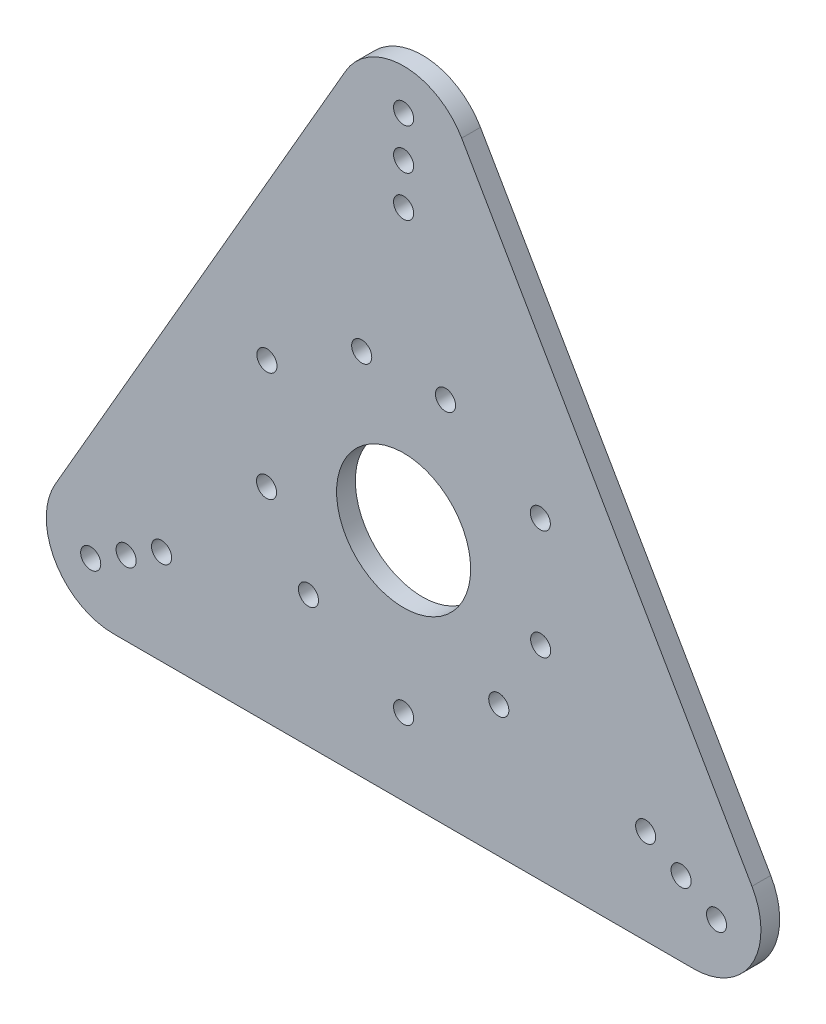
ISO-10303-21;
HEADER;
FILE_DESCRIPTION(('STEP AP214'),'2;1');
FILE_NAME('part.step','',(''),(''),'','','');
FILE_SCHEMA(('AUTOMOTIVE_DESIGN { 1 0 10303 214 1 1 1 1 }'));
ENDSEC;
DATA;
#1=APPLICATION_CONTEXT('core data for automotive mechanical design processes');
#2=APPLICATION_PROTOCOL_DEFINITION('international standard','automotive_design',2000,#1);
#3=PRODUCT_CONTEXT('',#1,'mechanical');
#4=PRODUCT('Part','Part','',(#3));
#5=PRODUCT_RELATED_PRODUCT_CATEGORY('part','',(#4));
#6=PRODUCT_DEFINITION_FORMATION('','',#4);
#7=PRODUCT_DEFINITION_CONTEXT('part definition',#1,'design');
#8=PRODUCT_DEFINITION('design','',#6,#7);
#9=PRODUCT_DEFINITION_SHAPE('','',#8);
#10=(LENGTH_UNIT() NAMED_UNIT(*) SI_UNIT(.MILLI.,.METRE.));
#11=(NAMED_UNIT(*) PLANE_ANGLE_UNIT() SI_UNIT($,.RADIAN.));
#12=(NAMED_UNIT(*) SI_UNIT($,.STERADIAN.) SOLID_ANGLE_UNIT());
#13=UNCERTAINTY_MEASURE_WITH_UNIT(LENGTH_MEASURE(1.E-05),#10,'distance_accuracy_value','');
#14=(GEOMETRIC_REPRESENTATION_CONTEXT(3) GLOBAL_UNCERTAINTY_ASSIGNED_CONTEXT((#13)) GLOBAL_UNIT_ASSIGNED_CONTEXT((#10,
#11,#12)) REPRESENTATION_CONTEXT('',''));
#15=CARTESIAN_POINT('',(0.,0.,0.));
#16=DIRECTION('',(0.,0.,1.));
#17=DIRECTION('',(1.,0.,0.));
#18=AXIS2_PLACEMENT_3D('',#15,#16,#17);
#19=CARTESIAN_POINT('',(71.2078011714026,-72.676944047218,2.8));
#20=DIRECTION('',(0.,0.,1.));
#21=DIRECTION('',(1.,0.,0.));
#22=AXIS2_PLACEMENT_3D('',#19,#20,#21);
#23=PLANE('',#22);
#24=CARTESIAN_POINT('',(128.704579436313,-63.0896028208707,2.8));
#25=DIRECTION('',(0.,0.,1.));
#26=DIRECTION('',(1.,0.,0.));
#27=AXIS2_PLACEMENT_3D('',#24,#25,#26);
#28=CIRCLE('',#27,1.5);
#29=CARTESIAN_POINT('',(130.204579436313,-63.0896028208707,2.8));
#30=VERTEX_POINT('',#29);
#31=EDGE_CURVE('E252',#30,#30,#28,.T.);
#32=ORIENTED_EDGE('',*,*,#31,.F.);
#33=EDGE_LOOP('',(#32));
#34=FACE_BOUND('',#33,.T.);
#35=CARTESIAN_POINT('',(94.0635632849358,-52.2642852735652,2.8));
#36=DIRECTION('',(0.,0.,1.));
#37=DIRECTION('',(1.,0.,0.));
#38=AXIS2_PLACEMENT_3D('',#35,#36,#37);
#39=CIRCLE('',#38,1.5);
#40=CARTESIAN_POINT('',(95.5635632849358,-52.2642852735652,2.8));
#41=VERTEX_POINT('',#40);
#42=EDGE_CURVE('E264',#41,#41,#39,.T.);
#43=ORIENTED_EDGE('',*,*,#42,.F.);
#44=EDGE_LOOP('',(#43));
#45=FACE_BOUND('',#44,.T.);
#46=CARTESIAN_POINT('',(120.759071360625,-27.676944047218,2.8));
#47=DIRECTION('',(0.,0.,1.));
#48=DIRECTION('',(1.,0.,0.));
#49=AXIS2_PLACEMENT_3D('',#46,#47,#48);
#50=CIRCLE('',#49,1.5);
#51=CARTESIAN_POINT('',(122.259071360625,-27.676944047218,2.8));
#52=VERTEX_POINT('',#51);
#53=EDGE_CURVE('E276',#52,#52,#50,.T.);
#54=ORIENTED_EDGE('',*,*,#53,.F.);
#55=EDGE_LOOP('',(#54));
#56=FACE_BOUND('',#55,.T.);
#57=CARTESIAN_POINT('',(150.615835507907,-68.523194047218,2.8));
#58=DIRECTION('',(0.,0.,1.));
#59=DIRECTION('',(1.,0.,0.));
#60=AXIS2_PLACEMENT_3D('',#57,#58,#59);
#61=CIRCLE('',#60,1.5);
#62=CARTESIAN_POINT('',(152.115835507907,-68.523194047218,2.8));
#63=VERTEX_POINT('',#62);
#64=EDGE_CURVE('E288',#63,#63,#61,.T.);
#65=ORIENTED_EDGE('',*,*,#64,.F.);
#66=EDGE_LOOP('',(#65));
#67=FACE_BOUND('',#66,.T.);
#68=CARTESIAN_POINT('',(161.185675561096,-74.625694047218,2.8));
#69=DIRECTION('',(0.,0.,1.));
#70=DIRECTION('',(1.,0.,0.));
#71=AXIS2_PLACEMENT_3D('',#68,#69,#70);
#72=CIRCLE('',#71,1.5);
#73=CARTESIAN_POINT('',(162.685675561096,-74.625694047218,2.8));
#74=VERTEX_POINT('',#73);
#75=EDGE_CURVE('E300',#74,#74,#72,.T.);
#76=ORIENTED_EDGE('',*,*,#75,.F.);
#77=EDGE_LOOP('',(#76));
#78=FACE_BOUND('',#77,.T.);
#79=CARTESIAN_POINT('',(73.1173871867473,-71.5744440472179,2.8));
#80=DIRECTION('',(0.,0.,1.));
#81=DIRECTION('',(1.,0.,0.));
#82=AXIS2_PLACEMENT_3D('',#79,#80,#81);
#83=CIRCLE('',#82,1.5);
#84=CARTESIAN_POINT('',(74.6173871867473,-71.5744440472179,2.8));
#85=VERTEX_POINT('',#84);
#86=EDGE_CURVE('E312',#85,#85,#83,.T.);
#87=ORIENTED_EDGE('',*,*,#86,.F.);
#88=EDGE_LOOP('',(#87));
#89=FACE_BOUND('',#88,.T.);
#90=CARTESIAN_POINT('',(114.509071360625,-5.98444404721797,2.8));
#91=DIRECTION('',(0.,0.,1.));
#92=DIRECTION('',(1.,0.,0.));
#93=AXIS2_PLACEMENT_3D('',#90,#91,#92);
#94=CIRCLE('',#93,1.5);
#95=CARTESIAN_POINT('',(116.009071360625,-5.98444404721797,2.8));
#96=VERTEX_POINT('',#95);
#97=EDGE_CURVE('E324',#96,#96,#94,.T.);
#98=ORIENTED_EDGE('',*,*,#97,.F.);
#99=EDGE_LOOP('',(#98));
#100=FACE_BOUND('',#99,.T.);
#101=CARTESIAN_POINT('',(114.509071360624,6.22055595278204,2.8));
#102=DIRECTION('',(0.,0.,1.));
#103=DIRECTION('',(1.,0.,0.));
#104=AXIS2_PLACEMENT_3D('',#101,#102,#103);
#105=CIRCLE('',#104,1.5);
#106=CARTESIAN_POINT('',(116.009071360624,6.22055595278204,2.8));
#107=VERTEX_POINT('',#106);
#108=EDGE_CURVE('E336',#107,#107,#105,.T.);
#109=ORIENTED_EDGE('',*,*,#108,.F.);
#110=EDGE_LOOP('',(#109));
#111=FACE_BOUND('',#110,.T.);
#112=CARTESIAN_POINT('',(134.899639492729,-35.904444047218,2.8));
#113=DIRECTION('',(0.,0.,1.));
#114=DIRECTION('',(1.,0.,0.));
#115=AXIS2_PLACEMENT_3D('',#112,#113,#114);
#116=CIRCLE('',#115,1.5);
#117=CARTESIAN_POINT('',(136.399639492729,-35.904444047218,2.8));
#118=VERTEX_POINT('',#117);
#119=EDGE_CURVE('E348',#118,#118,#116,.T.);
#120=ORIENTED_EDGE('',*,*,#119,.F.);
#121=EDGE_LOOP('',(#120));
#122=FACE_BOUND('',#121,.T.);
#123=CARTESIAN_POINT('',(71.2078011714026,-72.676944047218,2.8));
#124=DIRECTION('',(0.,0.,1.));
#125=DIRECTION('',(1.,0.,0.));
#126=AXIS2_PLACEMENT_3D('',#123,#124,#125);
#127=CIRCLE('',#126,9.99999999999999);
#128=CARTESIAN_POINT('',(62.5475471335583,-67.676944047218,2.8));
#129=VERTEX_POINT('',#128);
#130=CARTESIAN_POINT('',(71.2078011714026,-82.676944047218,2.8));
#131=VERTEX_POINT('',#130);
#132=EDGE_CURVE('E132',#129,#131,#127,.T.);
#133=ORIENTED_EDGE('',*,*,#132,.T.);
#134=DIRECTION('',(1.,0.,0.));
#135=VECTOR('',#134,1.);
#136=CARTESIAN_POINT('',(71.2078011714026,-82.676944047218,2.8));
#137=LINE('',#136,#135);
#138=CARTESIAN_POINT('',(157.810341549847,-82.676944047218,2.8));
#139=VERTEX_POINT('',#138);
#140=EDGE_CURVE('E90',#131,#139,#137,.T.);
#141=ORIENTED_EDGE('',*,*,#140,.T.);
#142=CARTESIAN_POINT('',(157.810341549846,-72.676944047218,2.8));
#143=DIRECTION('',(0.,0.,1.));
#144=DIRECTION('',(1.,0.,0.));
#145=AXIS2_PLACEMENT_3D('',#142,#143,#144);
#146=CIRCLE('',#145,10.);
#147=CARTESIAN_POINT('',(166.470595587691,-67.676944047218,2.8));
#148=VERTEX_POINT('',#147);
#149=EDGE_CURVE('E103',#139,#148,#146,.T.);
#150=ORIENTED_EDGE('',*,*,#149,.T.);
#151=DIRECTION('',(-0.5,0.866025403784438,0.));
#152=VECTOR('',#151,1.);
#153=CARTESIAN_POINT('',(166.470595587691,-67.676944047218,2.8));
#154=LINE('',#153,#152);
#155=CARTESIAN_POINT('',(123.169325398469,7.32305595278203,2.8));
#156=VERTEX_POINT('',#155);
#157=EDGE_CURVE('E97',#148,#156,#154,.T.);
#158=ORIENTED_EDGE('',*,*,#157,.T.);
#159=CARTESIAN_POINT('',(114.509071360625,2.32305595278204,2.8));
#160=DIRECTION('',(0.,0.,1.));
#161=DIRECTION('',(1.,0.,0.));
#162=AXIS2_PLACEMENT_3D('',#159,#160,#161);
#163=CIRCLE('',#162,9.99999999999998);
#164=CARTESIAN_POINT('',(105.84881732278,7.32305595278203,2.8));
#165=VERTEX_POINT('',#164);
#166=EDGE_CURVE('E101',#156,#165,#163,.T.);
#167=ORIENTED_EDGE('',*,*,#166,.T.);
#168=DIRECTION('',(-0.5,-0.866025403784439,0.));
#169=VECTOR('',#168,1.);
#170=CARTESIAN_POINT('',(105.84881732278,7.32305595278203,2.8));
#171=LINE('',#170,#169);
#172=EDGE_CURVE('E53',#165,#129,#171,.T.);
#173=ORIENTED_EDGE('',*,*,#172,.T.);
#174=EDGE_LOOP('',(#133,#141,#150,#158,#167,#173));
#175=FACE_BOUND('',#174,.T.);
#176=CARTESIAN_POINT('',(114.509071360624,-71.221944047218,2.8));
#177=DIRECTION('',(0.,0.,1.));
#178=DIRECTION('',(1.,0.,0.));
#179=AXIS2_PLACEMENT_3D('',#176,#177,#178);
#180=CIRCLE('',#179,1.5);
#181=CARTESIAN_POINT('',(116.009071360624,-71.221944047218,2.8));
#182=VERTEX_POINT('',#181);
#183=EDGE_CURVE('E125',#182,#182,#180,.T.);
#184=ORIENTED_EDGE('',*,*,#183,.F.);
#185=EDGE_LOOP('',(#184));
#186=FACE_BOUND('',#185,.T.);
#187=CARTESIAN_POINT('',(94.1185032285199,-35.904444047218,2.8));
#188=DIRECTION('',(0.,0.,1.));
#189=DIRECTION('',(1.,0.,0.));
#190=AXIS2_PLACEMENT_3D('',#187,#188,#189);
#191=CIRCLE('',#190,1.5);
#192=CARTESIAN_POINT('',(95.6185032285199,-35.904444047218,2.8));
#193=VERTEX_POINT('',#192);
#194=EDGE_CURVE('E342',#193,#193,#191,.T.);
#195=ORIENTED_EDGE('',*,*,#194,.F.);
#196=EDGE_LOOP('',(#195));
#197=FACE_BOUND('',#196,.T.);
#198=CARTESIAN_POINT('',(114.509071360624,0.11805595278204,2.8));
#199=DIRECTION('',(0.,0.,1.));
#200=DIRECTION('',(1.,0.,0.));
#201=AXIS2_PLACEMENT_3D('',#198,#199,#200);
#202=CIRCLE('',#201,1.5);
#203=CARTESIAN_POINT('',(116.009071360624,0.11805595278204,2.8));
#204=VERTEX_POINT('',#203);
#205=EDGE_CURVE('E330',#204,#204,#202,.T.);
#206=ORIENTED_EDGE('',*,*,#205,.F.);
#207=EDGE_LOOP('',(#206));
#208=FACE_BOUND('',#207,.T.);
#209=CARTESIAN_POINT('',(67.8324671601528,-74.625694047218,2.8));
#210=DIRECTION('',(0.,0.,1.));
#211=DIRECTION('',(1.,0.,0.));
#212=AXIS2_PLACEMENT_3D('',#209,#210,#211);
#213=CIRCLE('',#212,1.5);
#214=CARTESIAN_POINT('',(69.3324671601528,-74.625694047218,2.8));
#215=VERTEX_POINT('',#214);
#216=EDGE_CURVE('E318',#215,#215,#213,.T.);
#217=ORIENTED_EDGE('',*,*,#216,.F.);
#218=EDGE_LOOP('',(#217));
#219=FACE_BOUND('',#218,.T.);
#220=CARTESIAN_POINT('',(78.4023072133418,-68.5231940472179,2.8));
#221=DIRECTION('',(0.,0.,1.));
#222=DIRECTION('',(1.,0.,0.));
#223=AXIS2_PLACEMENT_3D('',#220,#221,#222);
#224=CIRCLE('',#223,1.5);
#225=CARTESIAN_POINT('',(79.9023072133419,-68.5231940472179,2.8));
#226=VERTEX_POINT('',#225);
#227=EDGE_CURVE('E306',#226,#226,#224,.T.);
#228=ORIENTED_EDGE('',*,*,#227,.F.);
#229=EDGE_LOOP('',(#228));
#230=FACE_BOUND('',#229,.T.);
#231=CARTESIAN_POINT('',(155.900755534502,-71.574444047218,2.8));
#232=DIRECTION('',(0.,0.,1.));
#233=DIRECTION('',(1.,0.,0.));
#234=AXIS2_PLACEMENT_3D('',#231,#232,#233);
#235=CIRCLE('',#234,1.5);
#236=CARTESIAN_POINT('',(157.400755534502,-71.574444047218,2.8));
#237=VERTEX_POINT('',#236);
#238=EDGE_CURVE('E294',#237,#237,#235,.T.);
#239=ORIENTED_EDGE('',*,*,#238,.F.);
#240=EDGE_LOOP('',(#239));
#241=FACE_BOUND('',#240,.T.);
#242=CARTESIAN_POINT('',(108.259071360625,-27.676944047218,2.8));
#243=DIRECTION('',(0.,0.,1.));
#244=DIRECTION('',(1.,0.,0.));
#245=AXIS2_PLACEMENT_3D('',#242,#243,#244);
#246=CIRCLE('',#245,1.5);
#247=CARTESIAN_POINT('',(109.759071360625,-27.676944047218,2.8));
#248=VERTEX_POINT('',#247);
#249=EDGE_CURVE('E282',#248,#248,#246,.T.);
#250=ORIENTED_EDGE('',*,*,#249,.F.);
#251=EDGE_LOOP('',(#250));
#252=FACE_BOUND('',#251,.T.);
#253=CARTESIAN_POINT('',(100.313563284936,-63.0896028208707,2.8));
#254=DIRECTION('',(0.,0.,1.));
#255=DIRECTION('',(1.,0.,0.));
#256=AXIS2_PLACEMENT_3D('',#253,#254,#255);
#257=CIRCLE('',#256,1.5);
#258=CARTESIAN_POINT('',(101.813563284936,-63.0896028208707,2.8));
#259=VERTEX_POINT('',#258);
#260=EDGE_CURVE('E270',#259,#259,#257,.T.);
#261=ORIENTED_EDGE('',*,*,#260,.F.);
#262=EDGE_LOOP('',(#261));
#263=FACE_BOUND('',#262,.T.);
#264=CARTESIAN_POINT('',(134.954579436313,-52.2642852735652,2.8));
#265=DIRECTION('',(0.,0.,1.));
#266=DIRECTION('',(1.,0.,0.));
#267=AXIS2_PLACEMENT_3D('',#264,#265,#266);
#268=CIRCLE('',#267,1.5);
#269=CARTESIAN_POINT('',(136.454579436313,-52.2642852735652,2.8));
#270=VERTEX_POINT('',#269);
#271=EDGE_CURVE('E258',#270,#270,#268,.T.);
#272=ORIENTED_EDGE('',*,*,#271,.F.);
#273=EDGE_LOOP('',(#272));
#274=FACE_BOUND('',#273,.T.);
#275=CARTESIAN_POINT('',(114.509071360625,-47.676944047218,2.8));
#276=DIRECTION('',(0.,0.,1.));
#277=DIRECTION('',(1.,0.,0.));
#278=AXIS2_PLACEMENT_3D('',#275,#276,#277);
#279=CIRCLE('',#278,10.);
#280=CARTESIAN_POINT('',(124.509071360625,-47.676944047218,2.8));
#281=VERTEX_POINT('',#280);
#282=EDGE_CURVE('E243',#281,#281,#279,.T.);
#283=ORIENTED_EDGE('',*,*,#282,.F.);
#284=EDGE_LOOP('',(#283));
#285=FACE_BOUND('',#284,.T.);
#286=ADVANCED_FACE('F36',(#34,#45,#56,#67,#78,#89,#100,#111,#122,#175,#186,#197,#208,#219,#230,
#241,#252,#263,#274,#285),#23,.T.);
#287=CARTESIAN_POINT('',(71.2078011714026,-72.676944047218,0.));
#288=DIRECTION('',(0.,0.,1.));
#289=DIRECTION('',(1.,0.,0.));
#290=AXIS2_PLACEMENT_3D('',#287,#288,#289);
#291=PLANE('',#290);
#292=CARTESIAN_POINT('',(71.2078011714026,-72.676944047218,0.));
#293=DIRECTION('',(0.,0.,1.));
#294=DIRECTION('',(1.,0.,0.));
#295=AXIS2_PLACEMENT_3D('',#292,#293,#294);
#296=CIRCLE('',#295,9.99999999999999);
#297=CARTESIAN_POINT('',(62.5475471335583,-67.676944047218,0.));
#298=VERTEX_POINT('',#297);
#299=CARTESIAN_POINT('',(71.2078011714026,-82.676944047218,0.));
#300=VERTEX_POINT('',#299);
#301=EDGE_CURVE('E121',#298,#300,#296,.T.);
#302=ORIENTED_EDGE('',*,*,#301,.F.);
#303=DIRECTION('',(-0.5,-0.866025403784439,0.));
#304=VECTOR('',#303,1.);
#305=CARTESIAN_POINT('',(105.84881732278,7.32305595278203,0.));
#306=LINE('',#305,#304);
#307=CARTESIAN_POINT('',(105.84881732278,7.32305595278203,0.));
#308=VERTEX_POINT('',#307);
#309=EDGE_CURVE('E82',#308,#298,#306,.T.);
#310=ORIENTED_EDGE('',*,*,#309,.F.);
#311=CARTESIAN_POINT('',(114.509071360625,2.32305595278204,0.));
#312=DIRECTION('',(0.,0.,1.));
#313=DIRECTION('',(1.,0.,0.));
#314=AXIS2_PLACEMENT_3D('',#311,#312,#313);
#315=CIRCLE('',#314,9.99999999999998);
#316=CARTESIAN_POINT('',(123.169325398469,7.32305595278203,0.));
#317=VERTEX_POINT('',#316);
#318=EDGE_CURVE('E76',#317,#308,#315,.T.);
#319=ORIENTED_EDGE('',*,*,#318,.F.);
#320=DIRECTION('',(-0.5,0.866025403784438,0.));
#321=VECTOR('',#320,1.);
#322=CARTESIAN_POINT('',(166.470595587691,-67.676944047218,0.));
#323=LINE('',#322,#321);
#324=CARTESIAN_POINT('',(166.470595587691,-67.676944047218,0.));
#325=VERTEX_POINT('',#324);
#326=EDGE_CURVE('E111',#325,#317,#323,.T.);
#327=ORIENTED_EDGE('',*,*,#326,.F.);
#328=CARTESIAN_POINT('',(157.810341549846,-72.676944047218,0.));
#329=DIRECTION('',(0.,0.,1.));
#330=DIRECTION('',(1.,0.,0.));
#331=AXIS2_PLACEMENT_3D('',#328,#329,#330);
#332=CIRCLE('',#331,10.);
#333=CARTESIAN_POINT('',(157.810341549847,-82.676944047218,0.));
#334=VERTEX_POINT('',#333);
#335=EDGE_CURVE('E127',#334,#325,#332,.T.);
#336=ORIENTED_EDGE('',*,*,#335,.F.);
#337=DIRECTION('',(1.,0.,0.));
#338=VECTOR('',#337,1.);
#339=CARTESIAN_POINT('',(71.2078011714026,-82.676944047218,0.));
#340=LINE('',#339,#338);
#341=EDGE_CURVE('E124',#300,#334,#340,.T.);
#342=ORIENTED_EDGE('',*,*,#341,.F.);
#343=EDGE_LOOP('',(#302,#310,#319,#327,#336,#342));
#344=FACE_BOUND('',#343,.T.);
#345=CARTESIAN_POINT('',(114.509071360624,-71.221944047218,0.));
#346=DIRECTION('',(0.,0.,1.));
#347=DIRECTION('',(1.,0.,0.));
#348=AXIS2_PLACEMENT_3D('',#345,#346,#347);
#349=CIRCLE('',#348,1.5);
#350=CARTESIAN_POINT('',(116.009071360624,-71.221944047218,0.));
#351=VERTEX_POINT('',#350);
#352=EDGE_CURVE('E351',#351,#351,#349,.T.);
#353=ORIENTED_EDGE('',*,*,#352,.T.);
#354=EDGE_LOOP('',(#353));
#355=FACE_BOUND('',#354,.T.);
#356=CARTESIAN_POINT('',(134.899639492729,-35.904444047218,0.));
#357=DIRECTION('',(0.,0.,1.));
#358=DIRECTION('',(1.,0.,0.));
#359=AXIS2_PLACEMENT_3D('',#356,#357,#358);
#360=CIRCLE('',#359,1.5);
#361=CARTESIAN_POINT('',(136.399639492729,-35.904444047218,0.));
#362=VERTEX_POINT('',#361);
#363=EDGE_CURVE('E345',#362,#362,#360,.T.);
#364=ORIENTED_EDGE('',*,*,#363,.T.);
#365=EDGE_LOOP('',(#364));
#366=FACE_BOUND('',#365,.T.);
#367=CARTESIAN_POINT('',(94.1185032285199,-35.904444047218,0.));
#368=DIRECTION('',(0.,0.,1.));
#369=DIRECTION('',(1.,0.,0.));
#370=AXIS2_PLACEMENT_3D('',#367,#368,#369);
#371=CIRCLE('',#370,1.5);
#372=CARTESIAN_POINT('',(95.6185032285199,-35.904444047218,0.));
#373=VERTEX_POINT('',#372);
#374=EDGE_CURVE('E339',#373,#373,#371,.T.);
#375=ORIENTED_EDGE('',*,*,#374,.T.);
#376=EDGE_LOOP('',(#375));
#377=FACE_BOUND('',#376,.T.);
#378=CARTESIAN_POINT('',(114.509071360624,6.22055595278204,0.));
#379=DIRECTION('',(0.,0.,1.));
#380=DIRECTION('',(1.,0.,0.));
#381=AXIS2_PLACEMENT_3D('',#378,#379,#380);
#382=CIRCLE('',#381,1.5);
#383=CARTESIAN_POINT('',(116.009071360624,6.22055595278204,0.));
#384=VERTEX_POINT('',#383);
#385=EDGE_CURVE('E333',#384,#384,#382,.T.);
#386=ORIENTED_EDGE('',*,*,#385,.T.);
#387=EDGE_LOOP('',(#386));
#388=FACE_BOUND('',#387,.T.);
#389=CARTESIAN_POINT('',(114.509071360624,0.11805595278204,0.));
#390=DIRECTION('',(0.,0.,1.));
#391=DIRECTION('',(1.,0.,0.));
#392=AXIS2_PLACEMENT_3D('',#389,#390,#391);
#393=CIRCLE('',#392,1.5);
#394=CARTESIAN_POINT('',(116.009071360624,0.11805595278204,0.));
#395=VERTEX_POINT('',#394);
#396=EDGE_CURVE('E327',#395,#395,#393,.T.);
#397=ORIENTED_EDGE('',*,*,#396,.T.);
#398=EDGE_LOOP('',(#397));
#399=FACE_BOUND('',#398,.T.);
#400=CARTESIAN_POINT('',(114.509071360625,-5.98444404721797,0.));
#401=DIRECTION('',(0.,0.,1.));
#402=DIRECTION('',(1.,0.,0.));
#403=AXIS2_PLACEMENT_3D('',#400,#401,#402);
#404=CIRCLE('',#403,1.5);
#405=CARTESIAN_POINT('',(116.009071360625,-5.98444404721797,0.));
#406=VERTEX_POINT('',#405);
#407=EDGE_CURVE('E321',#406,#406,#404,.T.);
#408=ORIENTED_EDGE('',*,*,#407,.T.);
#409=EDGE_LOOP('',(#408));
#410=FACE_BOUND('',#409,.T.);
#411=CARTESIAN_POINT('',(67.8324671601528,-74.625694047218,0.));
#412=DIRECTION('',(0.,0.,1.));
#413=DIRECTION('',(1.,0.,0.));
#414=AXIS2_PLACEMENT_3D('',#411,#412,#413);
#415=CIRCLE('',#414,1.5);
#416=CARTESIAN_POINT('',(69.3324671601528,-74.625694047218,0.));
#417=VERTEX_POINT('',#416);
#418=EDGE_CURVE('E315',#417,#417,#415,.T.);
#419=ORIENTED_EDGE('',*,*,#418,.T.);
#420=EDGE_LOOP('',(#419));
#421=FACE_BOUND('',#420,.T.);
#422=CARTESIAN_POINT('',(73.1173871867473,-71.5744440472179,0.));
#423=DIRECTION('',(0.,0.,1.));
#424=DIRECTION('',(1.,0.,0.));
#425=AXIS2_PLACEMENT_3D('',#422,#423,#424);
#426=CIRCLE('',#425,1.5);
#427=CARTESIAN_POINT('',(74.6173871867473,-71.5744440472179,0.));
#428=VERTEX_POINT('',#427);
#429=EDGE_CURVE('E309',#428,#428,#426,.T.);
#430=ORIENTED_EDGE('',*,*,#429,.T.);
#431=EDGE_LOOP('',(#430));
#432=FACE_BOUND('',#431,.T.);
#433=CARTESIAN_POINT('',(78.4023072133418,-68.5231940472179,0.));
#434=DIRECTION('',(0.,0.,1.));
#435=DIRECTION('',(1.,0.,0.));
#436=AXIS2_PLACEMENT_3D('',#433,#434,#435);
#437=CIRCLE('',#436,1.5);
#438=CARTESIAN_POINT('',(79.9023072133419,-68.5231940472179,0.));
#439=VERTEX_POINT('',#438);
#440=EDGE_CURVE('E303',#439,#439,#437,.T.);
#441=ORIENTED_EDGE('',*,*,#440,.T.);
#442=EDGE_LOOP('',(#441));
#443=FACE_BOUND('',#442,.T.);
#444=CARTESIAN_POINT('',(161.185675561096,-74.625694047218,0.));
#445=DIRECTION('',(0.,0.,1.));
#446=DIRECTION('',(1.,0.,0.));
#447=AXIS2_PLACEMENT_3D('',#444,#445,#446);
#448=CIRCLE('',#447,1.5);
#449=CARTESIAN_POINT('',(162.685675561096,-74.625694047218,0.));
#450=VERTEX_POINT('',#449);
#451=EDGE_CURVE('E297',#450,#450,#448,.T.);
#452=ORIENTED_EDGE('',*,*,#451,.T.);
#453=EDGE_LOOP('',(#452));
#454=FACE_BOUND('',#453,.T.);
#455=CARTESIAN_POINT('',(155.900755534502,-71.574444047218,0.));
#456=DIRECTION('',(0.,0.,1.));
#457=DIRECTION('',(1.,0.,0.));
#458=AXIS2_PLACEMENT_3D('',#455,#456,#457);
#459=CIRCLE('',#458,1.5);
#460=CARTESIAN_POINT('',(157.400755534502,-71.574444047218,0.));
#461=VERTEX_POINT('',#460);
#462=EDGE_CURVE('E291',#461,#461,#459,.T.);
#463=ORIENTED_EDGE('',*,*,#462,.T.);
#464=EDGE_LOOP('',(#463));
#465=FACE_BOUND('',#464,.T.);
#466=CARTESIAN_POINT('',(150.615835507907,-68.523194047218,0.));
#467=DIRECTION('',(0.,0.,1.));
#468=DIRECTION('',(1.,0.,0.));
#469=AXIS2_PLACEMENT_3D('',#466,#467,#468);
#470=CIRCLE('',#469,1.5);
#471=CARTESIAN_POINT('',(152.115835507907,-68.523194047218,0.));
#472=VERTEX_POINT('',#471);
#473=EDGE_CURVE('E285',#472,#472,#470,.T.);
#474=ORIENTED_EDGE('',*,*,#473,.T.);
#475=EDGE_LOOP('',(#474));
#476=FACE_BOUND('',#475,.T.);
#477=CARTESIAN_POINT('',(108.259071360625,-27.676944047218,0.));
#478=DIRECTION('',(0.,0.,1.));
#479=DIRECTION('',(1.,0.,0.));
#480=AXIS2_PLACEMENT_3D('',#477,#478,#479);
#481=CIRCLE('',#480,1.5);
#482=CARTESIAN_POINT('',(109.759071360625,-27.676944047218,0.));
#483=VERTEX_POINT('',#482);
#484=EDGE_CURVE('E279',#483,#483,#481,.T.);
#485=ORIENTED_EDGE('',*,*,#484,.T.);
#486=EDGE_LOOP('',(#485));
#487=FACE_BOUND('',#486,.T.);
#488=CARTESIAN_POINT('',(120.759071360625,-27.676944047218,0.));
#489=DIRECTION('',(0.,0.,1.));
#490=DIRECTION('',(1.,0.,0.));
#491=AXIS2_PLACEMENT_3D('',#488,#489,#490);
#492=CIRCLE('',#491,1.5);
#493=CARTESIAN_POINT('',(122.259071360625,-27.676944047218,0.));
#494=VERTEX_POINT('',#493);
#495=EDGE_CURVE('E273',#494,#494,#492,.T.);
#496=ORIENTED_EDGE('',*,*,#495,.T.);
#497=EDGE_LOOP('',(#496));
#498=FACE_BOUND('',#497,.T.);
#499=CARTESIAN_POINT('',(100.313563284936,-63.0896028208707,0.));
#500=DIRECTION('',(0.,0.,1.));
#501=DIRECTION('',(1.,0.,0.));
#502=AXIS2_PLACEMENT_3D('',#499,#500,#501);
#503=CIRCLE('',#502,1.5);
#504=CARTESIAN_POINT('',(101.813563284936,-63.0896028208707,0.));
#505=VERTEX_POINT('',#504);
#506=EDGE_CURVE('E267',#505,#505,#503,.T.);
#507=ORIENTED_EDGE('',*,*,#506,.T.);
#508=EDGE_LOOP('',(#507));
#509=FACE_BOUND('',#508,.T.);
#510=CARTESIAN_POINT('',(94.0635632849358,-52.2642852735652,0.));
#511=DIRECTION('',(0.,0.,1.));
#512=DIRECTION('',(1.,0.,0.));
#513=AXIS2_PLACEMENT_3D('',#510,#511,#512);
#514=CIRCLE('',#513,1.5);
#515=CARTESIAN_POINT('',(95.5635632849358,-52.2642852735652,0.));
#516=VERTEX_POINT('',#515);
#517=EDGE_CURVE('E261',#516,#516,#514,.T.);
#518=ORIENTED_EDGE('',*,*,#517,.T.);
#519=EDGE_LOOP('',(#518));
#520=FACE_BOUND('',#519,.T.);
#521=CARTESIAN_POINT('',(134.954579436313,-52.2642852735652,0.));
#522=DIRECTION('',(0.,0.,1.));
#523=DIRECTION('',(1.,0.,0.));
#524=AXIS2_PLACEMENT_3D('',#521,#522,#523);
#525=CIRCLE('',#524,1.5);
#526=CARTESIAN_POINT('',(136.454579436313,-52.2642852735652,0.));
#527=VERTEX_POINT('',#526);
#528=EDGE_CURVE('E255',#527,#527,#525,.T.);
#529=ORIENTED_EDGE('',*,*,#528,.T.);
#530=EDGE_LOOP('',(#529));
#531=FACE_BOUND('',#530,.T.);
#532=CARTESIAN_POINT('',(128.704579436313,-63.0896028208707,0.));
#533=DIRECTION('',(0.,0.,1.));
#534=DIRECTION('',(1.,0.,0.));
#535=AXIS2_PLACEMENT_3D('',#532,#533,#534);
#536=CIRCLE('',#535,1.5);
#537=CARTESIAN_POINT('',(130.204579436313,-63.0896028208707,0.));
#538=VERTEX_POINT('',#537);
#539=EDGE_CURVE('E249',#538,#538,#536,.T.);
#540=ORIENTED_EDGE('',*,*,#539,.T.);
#541=EDGE_LOOP('',(#540));
#542=FACE_BOUND('',#541,.T.);
#543=CARTESIAN_POINT('',(114.509071360625,-47.676944047218,0.));
#544=DIRECTION('',(0.,0.,1.));
#545=DIRECTION('',(1.,0.,0.));
#546=AXIS2_PLACEMENT_3D('',#543,#544,#545);
#547=CIRCLE('',#546,10.);
#548=CARTESIAN_POINT('',(124.509071360625,-47.676944047218,0.));
#549=VERTEX_POINT('',#548);
#550=EDGE_CURVE('E246',#549,#549,#547,.T.);
#551=ORIENTED_EDGE('',*,*,#550,.T.);
#552=EDGE_LOOP('',(#551));
#553=FACE_BOUND('',#552,.T.);
#554=ADVANCED_FACE('F141',(#344,#355,#366,#377,#388,#399,#410,#421,#432,#443,#454,#465,#476,
#487,#498,#509,#520,#531,#542,#553),#291,.F.);
#555=CARTESIAN_POINT('',(71.2078011714026,-72.676944047218,2.8));
#556=DIRECTION('',(0.,0.,-1.));
#557=DIRECTION('',(-1.,0.,0.));
#558=AXIS2_PLACEMENT_3D('',#555,#556,#557);
#559=CYLINDRICAL_SURFACE('',#558,9.99999999999999);
#560=ORIENTED_EDGE('',*,*,#301,.T.);
#561=DIRECTION('',(0.,0.,-1.));
#562=VECTOR('',#561,1.);
#563=CARTESIAN_POINT('',(71.2078011714026,-82.676944047218,2.8));
#564=LINE('',#563,#562);
#565=EDGE_CURVE('E11',#131,#300,#564,.T.);
#566=ORIENTED_EDGE('',*,*,#565,.F.);
#567=ORIENTED_EDGE('',*,*,#132,.F.);
#568=DIRECTION('',(0.,0.,-1.));
#569=VECTOR('',#568,1.);
#570=CARTESIAN_POINT('',(62.5475471335583,-67.676944047218,2.8));
#571=LINE('',#570,#569);
#572=EDGE_CURVE('E117',#129,#298,#571,.T.);
#573=ORIENTED_EDGE('',*,*,#572,.T.);
#574=EDGE_LOOP('',(#560,#566,#567,#573));
#575=FACE_BOUND('',#574,.T.);
#576=ADVANCED_FACE('F38',(#575),#559,.T.);
#577=CARTESIAN_POINT('',(71.2078011714026,-82.676944047218,2.8));
#578=DIRECTION('',(0.,1.,0.));
#579=DIRECTION('',(-1.,0.,0.));
#580=AXIS2_PLACEMENT_3D('',#577,#578,#579);
#581=PLANE('',#580);
#582=ORIENTED_EDGE('',*,*,#341,.T.);
#583=DIRECTION('',(0.,0.,-1.));
#584=VECTOR('',#583,1.);
#585=CARTESIAN_POINT('',(157.810341549847,-82.676944047218,2.8));
#586=LINE('',#585,#584);
#587=EDGE_CURVE('E45',#139,#334,#586,.T.);
#588=ORIENTED_EDGE('',*,*,#587,.F.);
#589=ORIENTED_EDGE('',*,*,#140,.F.);
#590=ORIENTED_EDGE('',*,*,#565,.T.);
#591=EDGE_LOOP('',(#582,#588,#589,#590));
#592=FACE_BOUND('',#591,.T.);
#593=ADVANCED_FACE('F564',(#592),#581,.F.);
#594=CARTESIAN_POINT('',(157.810341549846,-72.676944047218,2.8));
#595=DIRECTION('',(0.,0.,-1.));
#596=DIRECTION('',(-1.,0.,0.));
#597=AXIS2_PLACEMENT_3D('',#594,#595,#596);
#598=CYLINDRICAL_SURFACE('',#597,10.);
#599=ORIENTED_EDGE('',*,*,#335,.T.);
#600=DIRECTION('',(0.,0.,-1.));
#601=VECTOR('',#600,1.);
#602=CARTESIAN_POINT('',(166.470595587691,-67.676944047218,2.8));
#603=LINE('',#602,#601);
#604=EDGE_CURVE('E112',#148,#325,#603,.T.);
#605=ORIENTED_EDGE('',*,*,#604,.F.);
#606=ORIENTED_EDGE('',*,*,#149,.F.);
#607=ORIENTED_EDGE('',*,*,#587,.T.);
#608=EDGE_LOOP('',(#599,#605,#606,#607));
#609=FACE_BOUND('',#608,.T.);
#610=ADVANCED_FACE('F138',(#609),#598,.T.);
#611=CARTESIAN_POINT('',(166.470595587691,-67.676944047218,2.8));
#612=DIRECTION('',(-0.866025403784438,-0.5,0.));
#613=DIRECTION('',(0.5,-0.866025403784439,0.));
#614=AXIS2_PLACEMENT_3D('',#611,#612,#613);
#615=PLANE('',#614);
#616=ORIENTED_EDGE('',*,*,#326,.T.);
#617=DIRECTION('',(0.,0.,-1.));
#618=VECTOR('',#617,1.);
#619=CARTESIAN_POINT('',(123.169325398469,7.32305595278203,2.8));
#620=LINE('',#619,#618);
#621=EDGE_CURVE('E108',#156,#317,#620,.T.);
#622=ORIENTED_EDGE('',*,*,#621,.F.);
#623=ORIENTED_EDGE('',*,*,#157,.F.);
#624=ORIENTED_EDGE('',*,*,#604,.T.);
#625=EDGE_LOOP('',(#616,#622,#623,#624));
#626=FACE_BOUND('',#625,.T.);
#627=ADVANCED_FACE('F109',(#626),#615,.F.);
#628=CARTESIAN_POINT('',(114.509071360625,2.32305595278204,2.8));
#629=DIRECTION('',(0.,0.,-1.));
#630=DIRECTION('',(-1.,0.,0.));
#631=AXIS2_PLACEMENT_3D('',#628,#629,#630);
#632=CYLINDRICAL_SURFACE('',#631,9.99999999999998);
#633=ORIENTED_EDGE('',*,*,#318,.T.);
#634=DIRECTION('',(0.,0.,-1.));
#635=VECTOR('',#634,1.);
#636=CARTESIAN_POINT('',(105.84881732278,7.32305595278203,2.8));
#637=LINE('',#636,#635);
#638=EDGE_CURVE('E113',#165,#308,#637,.T.);
#639=ORIENTED_EDGE('',*,*,#638,.F.);
#640=ORIENTED_EDGE('',*,*,#166,.F.);
#641=ORIENTED_EDGE('',*,*,#621,.T.);
#642=EDGE_LOOP('',(#633,#639,#640,#641));
#643=FACE_BOUND('',#642,.T.);
#644=ADVANCED_FACE('F115',(#643),#632,.T.);
#645=CARTESIAN_POINT('',(105.84881732278,7.32305595278203,2.8));
#646=DIRECTION('',(0.866025403784439,-0.5,0.));
#647=DIRECTION('',(0.5,0.866025403784439,0.));
#648=AXIS2_PLACEMENT_3D('',#645,#646,#647);
#649=PLANE('',#648);
#650=ORIENTED_EDGE('',*,*,#309,.T.);
#651=ORIENTED_EDGE('',*,*,#572,.F.);
#652=ORIENTED_EDGE('',*,*,#172,.F.);
#653=ORIENTED_EDGE('',*,*,#638,.T.);
#654=EDGE_LOOP('',(#650,#651,#652,#653));
#655=FACE_BOUND('',#654,.T.);
#656=ADVANCED_FACE('F146',(#655),#649,.F.);
#657=CARTESIAN_POINT('',(114.509071360624,-71.221944047218,2.8));
#658=DIRECTION('',(0.,0.,-1.));
#659=DIRECTION('',(-1.,0.,0.));
#660=AXIS2_PLACEMENT_3D('',#657,#658,#659);
#661=CYLINDRICAL_SURFACE('',#660,1.5);
#662=ORIENTED_EDGE('',*,*,#183,.T.);
#663=EDGE_LOOP('',(#662));
#664=FACE_BOUND('',#663,.T.);
#665=ORIENTED_EDGE('',*,*,#352,.F.);
#666=EDGE_LOOP('',(#665));
#667=FACE_BOUND('',#666,.T.);
#668=ADVANCED_FACE('F148',(#664,#667),#661,.F.);
#669=CARTESIAN_POINT('',(134.899639492729,-35.904444047218,2.8));
#670=DIRECTION('',(0.,0.,-1.));
#671=DIRECTION('',(-1.,0.,0.));
#672=AXIS2_PLACEMENT_3D('',#669,#670,#671);
#673=CYLINDRICAL_SURFACE('',#672,1.5);
#674=ORIENTED_EDGE('',*,*,#119,.T.);
#675=EDGE_LOOP('',(#674));
#676=FACE_BOUND('',#675,.T.);
#677=ORIENTED_EDGE('',*,*,#363,.F.);
#678=EDGE_LOOP('',(#677));
#679=FACE_BOUND('',#678,.T.);
#680=ADVANCED_FACE('F154',(#676,#679),#673,.F.);
#681=CARTESIAN_POINT('',(94.1185032285199,-35.904444047218,2.8));
#682=DIRECTION('',(0.,0.,-1.));
#683=DIRECTION('',(-1.,0.,0.));
#684=AXIS2_PLACEMENT_3D('',#681,#682,#683);
#685=CYLINDRICAL_SURFACE('',#684,1.5);
#686=ORIENTED_EDGE('',*,*,#194,.T.);
#687=EDGE_LOOP('',(#686));
#688=FACE_BOUND('',#687,.T.);
#689=ORIENTED_EDGE('',*,*,#374,.F.);
#690=EDGE_LOOP('',(#689));
#691=FACE_BOUND('',#690,.T.);
#692=ADVANCED_FACE('F170',(#688,#691),#685,.F.);
#693=CARTESIAN_POINT('',(114.509071360624,6.22055595278204,2.8));
#694=DIRECTION('',(0.,0.,-1.));
#695=DIRECTION('',(-1.,0.,0.));
#696=AXIS2_PLACEMENT_3D('',#693,#694,#695);
#697=CYLINDRICAL_SURFACE('',#696,1.5);
#698=ORIENTED_EDGE('',*,*,#108,.T.);
#699=EDGE_LOOP('',(#698));
#700=FACE_BOUND('',#699,.T.);
#701=ORIENTED_EDGE('',*,*,#385,.F.);
#702=EDGE_LOOP('',(#701));
#703=FACE_BOUND('',#702,.T.);
#704=ADVANCED_FACE('F174',(#700,#703),#697,.F.);
#705=CARTESIAN_POINT('',(114.509071360624,0.11805595278204,2.8));
#706=DIRECTION('',(0.,0.,-1.));
#707=DIRECTION('',(-1.,0.,0.));
#708=AXIS2_PLACEMENT_3D('',#705,#706,#707);
#709=CYLINDRICAL_SURFACE('',#708,1.5);
#710=ORIENTED_EDGE('',*,*,#205,.T.);
#711=EDGE_LOOP('',(#710));
#712=FACE_BOUND('',#711,.T.);
#713=ORIENTED_EDGE('',*,*,#396,.F.);
#714=EDGE_LOOP('',(#713));
#715=FACE_BOUND('',#714,.T.);
#716=ADVANCED_FACE('F178',(#712,#715),#709,.F.);
#717=CARTESIAN_POINT('',(114.509071360625,-5.98444404721797,2.8));
#718=DIRECTION('',(0.,0.,-1.));
#719=DIRECTION('',(-1.,0.,0.));
#720=AXIS2_PLACEMENT_3D('',#717,#718,#719);
#721=CYLINDRICAL_SURFACE('',#720,1.5);
#722=ORIENTED_EDGE('',*,*,#97,.T.);
#723=EDGE_LOOP('',(#722));
#724=FACE_BOUND('',#723,.T.);
#725=ORIENTED_EDGE('',*,*,#407,.F.);
#726=EDGE_LOOP('',(#725));
#727=FACE_BOUND('',#726,.T.);
#728=ADVANCED_FACE('F182',(#724,#727),#721,.F.);
#729=CARTESIAN_POINT('',(67.8324671601528,-74.625694047218,2.8));
#730=DIRECTION('',(0.,0.,-1.));
#731=DIRECTION('',(-1.,0.,0.));
#732=AXIS2_PLACEMENT_3D('',#729,#730,#731);
#733=CYLINDRICAL_SURFACE('',#732,1.5);
#734=ORIENTED_EDGE('',*,*,#216,.T.);
#735=EDGE_LOOP('',(#734));
#736=FACE_BOUND('',#735,.T.);
#737=ORIENTED_EDGE('',*,*,#418,.F.);
#738=EDGE_LOOP('',(#737));
#739=FACE_BOUND('',#738,.T.);
#740=ADVANCED_FACE('F186',(#736,#739),#733,.F.);
#741=CARTESIAN_POINT('',(73.1173871867473,-71.5744440472179,2.8));
#742=DIRECTION('',(0.,0.,-1.));
#743=DIRECTION('',(-1.,0.,0.));
#744=AXIS2_PLACEMENT_3D('',#741,#742,#743);
#745=CYLINDRICAL_SURFACE('',#744,1.5);
#746=ORIENTED_EDGE('',*,*,#86,.T.);
#747=EDGE_LOOP('',(#746));
#748=FACE_BOUND('',#747,.T.);
#749=ORIENTED_EDGE('',*,*,#429,.F.);
#750=EDGE_LOOP('',(#749));
#751=FACE_BOUND('',#750,.T.);
#752=ADVANCED_FACE('F190',(#748,#751),#745,.F.);
#753=CARTESIAN_POINT('',(78.4023072133418,-68.5231940472179,2.8));
#754=DIRECTION('',(0.,0.,-1.));
#755=DIRECTION('',(-1.,0.,0.));
#756=AXIS2_PLACEMENT_3D('',#753,#754,#755);
#757=CYLINDRICAL_SURFACE('',#756,1.5);
#758=ORIENTED_EDGE('',*,*,#227,.T.);
#759=EDGE_LOOP('',(#758));
#760=FACE_BOUND('',#759,.T.);
#761=ORIENTED_EDGE('',*,*,#440,.F.);
#762=EDGE_LOOP('',(#761));
#763=FACE_BOUND('',#762,.T.);
#764=ADVANCED_FACE('F194',(#760,#763),#757,.F.);
#765=CARTESIAN_POINT('',(161.185675561096,-74.625694047218,2.8));
#766=DIRECTION('',(0.,0.,-1.));
#767=DIRECTION('',(-1.,0.,0.));
#768=AXIS2_PLACEMENT_3D('',#765,#766,#767);
#769=CYLINDRICAL_SURFACE('',#768,1.5);
#770=ORIENTED_EDGE('',*,*,#75,.T.);
#771=EDGE_LOOP('',(#770));
#772=FACE_BOUND('',#771,.T.);
#773=ORIENTED_EDGE('',*,*,#451,.F.);
#774=EDGE_LOOP('',(#773));
#775=FACE_BOUND('',#774,.T.);
#776=ADVANCED_FACE('F198',(#772,#775),#769,.F.);
#777=CARTESIAN_POINT('',(155.900755534502,-71.574444047218,2.8));
#778=DIRECTION('',(0.,0.,-1.));
#779=DIRECTION('',(-1.,0.,0.));
#780=AXIS2_PLACEMENT_3D('',#777,#778,#779);
#781=CYLINDRICAL_SURFACE('',#780,1.5);
#782=ORIENTED_EDGE('',*,*,#238,.T.);
#783=EDGE_LOOP('',(#782));
#784=FACE_BOUND('',#783,.T.);
#785=ORIENTED_EDGE('',*,*,#462,.F.);
#786=EDGE_LOOP('',(#785));
#787=FACE_BOUND('',#786,.T.);
#788=ADVANCED_FACE('F202',(#784,#787),#781,.F.);
#789=CARTESIAN_POINT('',(150.615835507907,-68.523194047218,2.8));
#790=DIRECTION('',(0.,0.,-1.));
#791=DIRECTION('',(-1.,0.,0.));
#792=AXIS2_PLACEMENT_3D('',#789,#790,#791);
#793=CYLINDRICAL_SURFACE('',#792,1.5);
#794=ORIENTED_EDGE('',*,*,#64,.T.);
#795=EDGE_LOOP('',(#794));
#796=FACE_BOUND('',#795,.T.);
#797=ORIENTED_EDGE('',*,*,#473,.F.);
#798=EDGE_LOOP('',(#797));
#799=FACE_BOUND('',#798,.T.);
#800=ADVANCED_FACE('F206',(#796,#799),#793,.F.);
#801=CARTESIAN_POINT('',(108.259071360625,-27.676944047218,2.8));
#802=DIRECTION('',(0.,0.,-1.));
#803=DIRECTION('',(-1.,0.,0.));
#804=AXIS2_PLACEMENT_3D('',#801,#802,#803);
#805=CYLINDRICAL_SURFACE('',#804,1.5);
#806=ORIENTED_EDGE('',*,*,#249,.T.);
#807=EDGE_LOOP('',(#806));
#808=FACE_BOUND('',#807,.T.);
#809=ORIENTED_EDGE('',*,*,#484,.F.);
#810=EDGE_LOOP('',(#809));
#811=FACE_BOUND('',#810,.T.);
#812=ADVANCED_FACE('F210',(#808,#811),#805,.F.);
#813=CARTESIAN_POINT('',(120.759071360625,-27.676944047218,2.8));
#814=DIRECTION('',(0.,0.,-1.));
#815=DIRECTION('',(-1.,0.,0.));
#816=AXIS2_PLACEMENT_3D('',#813,#814,#815);
#817=CYLINDRICAL_SURFACE('',#816,1.5);
#818=ORIENTED_EDGE('',*,*,#53,.T.);
#819=EDGE_LOOP('',(#818));
#820=FACE_BOUND('',#819,.T.);
#821=ORIENTED_EDGE('',*,*,#495,.F.);
#822=EDGE_LOOP('',(#821));
#823=FACE_BOUND('',#822,.T.);
#824=ADVANCED_FACE('F214',(#820,#823),#817,.F.);
#825=CARTESIAN_POINT('',(100.313563284936,-63.0896028208707,2.8));
#826=DIRECTION('',(0.,0.,-1.));
#827=DIRECTION('',(-1.,0.,0.));
#828=AXIS2_PLACEMENT_3D('',#825,#826,#827);
#829=CYLINDRICAL_SURFACE('',#828,1.5);
#830=ORIENTED_EDGE('',*,*,#260,.T.);
#831=EDGE_LOOP('',(#830));
#832=FACE_BOUND('',#831,.T.);
#833=ORIENTED_EDGE('',*,*,#506,.F.);
#834=EDGE_LOOP('',(#833));
#835=FACE_BOUND('',#834,.T.);
#836=ADVANCED_FACE('F218',(#832,#835),#829,.F.);
#837=CARTESIAN_POINT('',(94.0635632849358,-52.2642852735652,2.8));
#838=DIRECTION('',(0.,0.,-1.));
#839=DIRECTION('',(-1.,0.,0.));
#840=AXIS2_PLACEMENT_3D('',#837,#838,#839);
#841=CYLINDRICAL_SURFACE('',#840,1.5);
#842=ORIENTED_EDGE('',*,*,#42,.T.);
#843=EDGE_LOOP('',(#842));
#844=FACE_BOUND('',#843,.T.);
#845=ORIENTED_EDGE('',*,*,#517,.F.);
#846=EDGE_LOOP('',(#845));
#847=FACE_BOUND('',#846,.T.);
#848=ADVANCED_FACE('F222',(#844,#847),#841,.F.);
#849=CARTESIAN_POINT('',(134.954579436313,-52.2642852735652,2.8));
#850=DIRECTION('',(0.,0.,-1.));
#851=DIRECTION('',(-1.,0.,0.));
#852=AXIS2_PLACEMENT_3D('',#849,#850,#851);
#853=CYLINDRICAL_SURFACE('',#852,1.5);
#854=ORIENTED_EDGE('',*,*,#271,.T.);
#855=EDGE_LOOP('',(#854));
#856=FACE_BOUND('',#855,.T.);
#857=ORIENTED_EDGE('',*,*,#528,.F.);
#858=EDGE_LOOP('',(#857));
#859=FACE_BOUND('',#858,.T.);
#860=ADVANCED_FACE('F226',(#856,#859),#853,.F.);
#861=CARTESIAN_POINT('',(128.704579436313,-63.0896028208707,2.8));
#862=DIRECTION('',(0.,0.,-1.));
#863=DIRECTION('',(-1.,0.,0.));
#864=AXIS2_PLACEMENT_3D('',#861,#862,#863);
#865=CYLINDRICAL_SURFACE('',#864,1.5);
#866=ORIENTED_EDGE('',*,*,#31,.T.);
#867=EDGE_LOOP('',(#866));
#868=FACE_BOUND('',#867,.T.);
#869=ORIENTED_EDGE('',*,*,#539,.F.);
#870=EDGE_LOOP('',(#869));
#871=FACE_BOUND('',#870,.T.);
#872=ADVANCED_FACE('F230',(#868,#871),#865,.F.);
#873=CARTESIAN_POINT('',(114.509071360625,-47.676944047218,2.8));
#874=DIRECTION('',(0.,0.,-1.));
#875=DIRECTION('',(-1.,0.,0.));
#876=AXIS2_PLACEMENT_3D('',#873,#874,#875);
#877=CYLINDRICAL_SURFACE('',#876,10.);
#878=ORIENTED_EDGE('',*,*,#282,.T.);
#879=EDGE_LOOP('',(#878));
#880=FACE_BOUND('',#879,.T.);
#881=ORIENTED_EDGE('',*,*,#550,.F.);
#882=EDGE_LOOP('',(#881));
#883=FACE_BOUND('',#882,.T.);
#884=ADVANCED_FACE('F234',(#880,#883),#877,.F.);
#885=CLOSED_SHELL('',(#286,#554,#576,#593,#610,#627,#644,#656,#668,#680,#692,#704,#716,#728,
#740,#752,#764,#776,#788,#800,#812,#824,#836,#848,#860,#872,#884));
#886=MANIFOLD_SOLID_BREP('B2',#885);
#887=ADVANCED_BREP_SHAPE_REPRESENTATION('',(#18,#886),#14);
#888=SHAPE_DEFINITION_REPRESENTATION(#9,#887);
ENDSEC;
END-ISO-10303-21;
